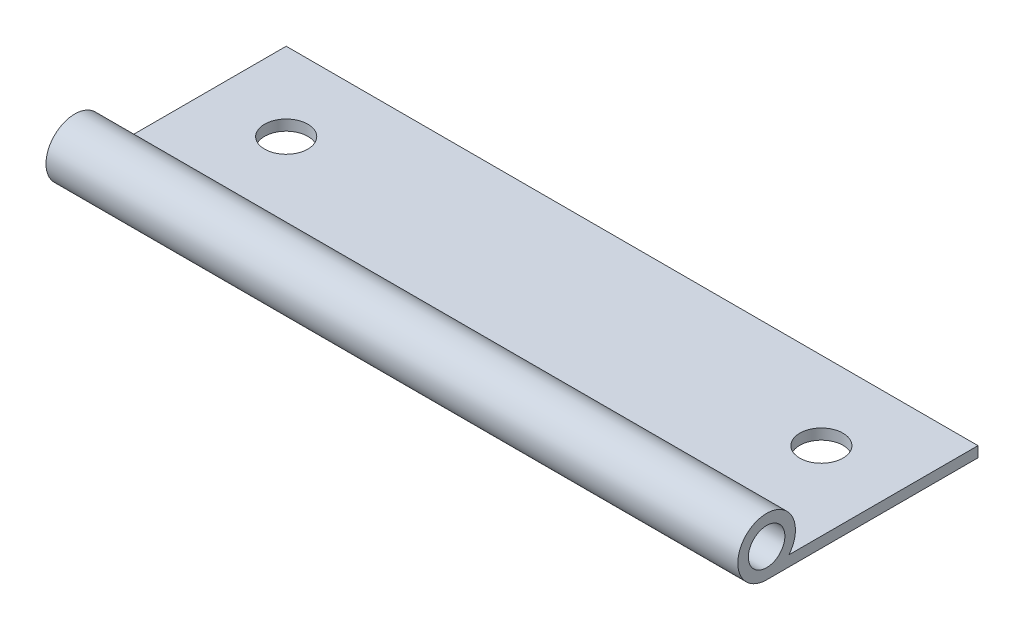
ISO-10303-21;
HEADER;
FILE_DESCRIPTION(('STEP AP214'),'2;1');
FILE_NAME('part.step','',(''),(''),'','','');
FILE_SCHEMA(('AUTOMOTIVE_DESIGN { 1 0 10303 214 1 1 1 1 }'));
ENDSEC;
DATA;
#1=APPLICATION_CONTEXT('core data for automotive mechanical design processes');
#2=APPLICATION_PROTOCOL_DEFINITION('international standard','automotive_design',2000,#1);
#3=PRODUCT_CONTEXT('',#1,'mechanical');
#4=PRODUCT('Part','Part','',(#3));
#5=PRODUCT_RELATED_PRODUCT_CATEGORY('part','',(#4));
#6=PRODUCT_DEFINITION_FORMATION('','',#4);
#7=PRODUCT_DEFINITION_CONTEXT('part definition',#1,'design');
#8=PRODUCT_DEFINITION('design','',#6,#7);
#9=PRODUCT_DEFINITION_SHAPE('','',#8);
#10=(LENGTH_UNIT() NAMED_UNIT(*) SI_UNIT(.MILLI.,.METRE.));
#11=(NAMED_UNIT(*) PLANE_ANGLE_UNIT() SI_UNIT($,.RADIAN.));
#12=(NAMED_UNIT(*) SI_UNIT($,.STERADIAN.) SOLID_ANGLE_UNIT());
#13=UNCERTAINTY_MEASURE_WITH_UNIT(LENGTH_MEASURE(1.E-05),#10,'distance_accuracy_value','');
#14=(GEOMETRIC_REPRESENTATION_CONTEXT(3) GLOBAL_UNCERTAINTY_ASSIGNED_CONTEXT((#13)) GLOBAL_UNIT_ASSIGNED_CONTEXT((#10,
#11,#12)) REPRESENTATION_CONTEXT('',''));
#15=CARTESIAN_POINT('',(0.,0.,0.));
#16=DIRECTION('',(0.,0.,1.));
#17=DIRECTION('',(1.,0.,0.));
#18=AXIS2_PLACEMENT_3D('',#15,#16,#17);
#19=CARTESIAN_POINT('',(72.,1.9,3.));
#20=DIRECTION('',(1.,0.,0.));
#21=DIRECTION('',(0.,0.,-1.));
#22=AXIS2_PLACEMENT_3D('',#19,#20,#21);
#23=PLANE('',#22);
#24=DIRECTION('',(0.,0.,1.));
#25=VECTOR('',#24,1.);
#26=CARTESIAN_POINT('',(72.,0.,0.));
#27=LINE('',#26,#25);
#28=CARTESIAN_POINT('',(72.,0.,-19.));
#29=VERTEX_POINT('',#28);
#30=CARTESIAN_POINT('',(72.,0.,0.678362646751216));
#31=VERTEX_POINT('',#30);
#32=EDGE_CURVE('E50',#29,#31,#27,.T.);
#33=ORIENTED_EDGE('',*,*,#32,.T.);
#34=CARTESIAN_POINT('',(72.,1.9,3.));
#35=DIRECTION('',(1.,0.,0.));
#36=DIRECTION('',(0.,0.,-1.));
#37=AXIS2_PLACEMENT_3D('',#34,#35,#36);
#38=CIRCLE('',#37,3.);
#39=CARTESIAN_POINT('',(72.,-1.1,3.));
#40=VERTEX_POINT('',#39);
#41=EDGE_CURVE('E80',#31,#40,#38,.T.);
#42=ORIENTED_EDGE('',*,*,#41,.T.);
#43=DIRECTION('',(0.,0.,-1.));
#44=VECTOR('',#43,1.);
#45=CARTESIAN_POINT('',(72.,-1.1,0.));
#46=LINE('',#45,#44);
#47=CARTESIAN_POINT('',(72.,-1.1,-19.));
#48=VERTEX_POINT('',#47);
#49=EDGE_CURVE('E84',#40,#48,#46,.T.);
#50=ORIENTED_EDGE('',*,*,#49,.T.);
#51=DIRECTION('',(0.,1.,0.));
#52=VECTOR('',#51,1.);
#53=CARTESIAN_POINT('',(72.,0.,-19.));
#54=LINE('',#53,#52);
#55=EDGE_CURVE('E92',#48,#29,#54,.T.);
#56=ORIENTED_EDGE('',*,*,#55,.T.);
#57=EDGE_LOOP('',(#33,#42,#50,#56));
#58=FACE_BOUND('',#57,.T.);
#59=CARTESIAN_POINT('',(72.,1.9,3.));
#60=DIRECTION('',(1.,0.,0.));
#61=DIRECTION('',(0.,0.,-1.));
#62=AXIS2_PLACEMENT_3D('',#59,#60,#61);
#63=CIRCLE('',#62,1.9);
#64=CARTESIAN_POINT('',(72.,1.9,1.1));
#65=VERTEX_POINT('',#64);
#66=EDGE_CURVE('E99',#65,#65,#63,.T.);
#67=ORIENTED_EDGE('',*,*,#66,.F.);
#68=EDGE_LOOP('',(#67));
#69=FACE_BOUND('',#68,.T.);
#70=ADVANCED_FACE('F33',(#58,#69),#23,.T.);
#71=CARTESIAN_POINT('',(0.,1.9,3.));
#72=DIRECTION('',(1.,0.,0.));
#73=DIRECTION('',(0.,0.,-1.));
#74=AXIS2_PLACEMENT_3D('',#71,#72,#73);
#75=PLANE('',#74);
#76=CARTESIAN_POINT('',(0.,1.9,3.));
#77=DIRECTION('',(1.,0.,0.));
#78=DIRECTION('',(0.,0.,-1.));
#79=AXIS2_PLACEMENT_3D('',#76,#77,#78);
#80=CIRCLE('',#79,3.);
#81=CARTESIAN_POINT('',(0.,0.,0.678362646751216));
#82=VERTEX_POINT('',#81);
#83=CARTESIAN_POINT('',(0.,-1.1,3.));
#84=VERTEX_POINT('',#83);
#85=EDGE_CURVE('E88',#82,#84,#80,.T.);
#86=ORIENTED_EDGE('',*,*,#85,.F.);
#87=DIRECTION('',(0.,0.,1.));
#88=VECTOR('',#87,1.);
#89=CARTESIAN_POINT('',(0.,0.,0.));
#90=LINE('',#89,#88);
#91=CARTESIAN_POINT('',(0.,0.,-19.));
#92=VERTEX_POINT('',#91);
#93=EDGE_CURVE('E102',#92,#82,#90,.T.);
#94=ORIENTED_EDGE('',*,*,#93,.F.);
#95=DIRECTION('',(0.,1.,0.));
#96=VECTOR('',#95,1.);
#97=CARTESIAN_POINT('',(0.,0.,-19.));
#98=LINE('',#97,#96);
#99=CARTESIAN_POINT('',(0.,-1.1,-19.));
#100=VERTEX_POINT('',#99);
#101=EDGE_CURVE('E74',#100,#92,#98,.T.);
#102=ORIENTED_EDGE('',*,*,#101,.F.);
#103=DIRECTION('',(0.,0.,-1.));
#104=VECTOR('',#103,1.);
#105=CARTESIAN_POINT('',(0.,-1.1,-19.));
#106=LINE('',#105,#104);
#107=EDGE_CURVE('E67',#84,#100,#106,.T.);
#108=ORIENTED_EDGE('',*,*,#107,.F.);
#109=EDGE_LOOP('',(#86,#94,#102,#108));
#110=FACE_BOUND('',#109,.T.);
#111=CARTESIAN_POINT('',(0.,1.9,3.));
#112=DIRECTION('',(1.,0.,0.));
#113=DIRECTION('',(0.,0.,-1.));
#114=AXIS2_PLACEMENT_3D('',#111,#112,#113);
#115=CIRCLE('',#114,1.9);
#116=CARTESIAN_POINT('',(0.,1.9,1.1));
#117=VERTEX_POINT('',#116);
#118=EDGE_CURVE('E155',#117,#117,#115,.T.);
#119=ORIENTED_EDGE('',*,*,#118,.T.);
#120=EDGE_LOOP('',(#119));
#121=FACE_BOUND('',#120,.T.);
#122=ADVANCED_FACE('F108',(#110,#121),#75,.F.);
#123=CARTESIAN_POINT('',(72.,1.9,3.));
#124=DIRECTION('',(-1.,0.,0.));
#125=DIRECTION('',(0.,0.,1.));
#126=AXIS2_PLACEMENT_3D('',#123,#124,#125);
#127=CYLINDRICAL_SURFACE('',#126,3.);
#128=ORIENTED_EDGE('',*,*,#85,.T.);
#129=DIRECTION('',(-1.,0.,0.));
#130=VECTOR('',#129,1.);
#131=CARTESIAN_POINT('',(72.,-1.1,3.));
#132=LINE('',#131,#130);
#133=EDGE_CURVE('E42',#40,#84,#132,.T.);
#134=ORIENTED_EDGE('',*,*,#133,.F.);
#135=ORIENTED_EDGE('',*,*,#41,.F.);
#136=DIRECTION('',(-1.,0.,0.));
#137=VECTOR('',#136,1.);
#138=CARTESIAN_POINT('',(72.,0.,0.678362646751216));
#139=LINE('',#138,#137);
#140=EDGE_CURVE('E11',#31,#82,#139,.T.);
#141=ORIENTED_EDGE('',*,*,#140,.T.);
#142=EDGE_LOOP('',(#128,#134,#135,#141));
#143=FACE_BOUND('',#142,.T.);
#144=ADVANCED_FACE('F35',(#143),#127,.T.);
#145=CARTESIAN_POINT('',(72.,-1.1,-19.));
#146=DIRECTION('',(0.,1.,0.));
#147=DIRECTION('',(0.,0.,1.));
#148=AXIS2_PLACEMENT_3D('',#145,#146,#147);
#149=PLANE('',#148);
#150=CARTESIAN_POINT('',(63.85,-1.1,-10.85));
#151=DIRECTION('',(0.,1.,0.));
#152=DIRECTION('',(0.,0.,-1.));
#153=AXIS2_PLACEMENT_3D('',#150,#151,#152);
#154=CIRCLE('',#153,2.25);
#155=CARTESIAN_POINT('',(63.85,-1.1,-13.1));
#156=VERTEX_POINT('',#155);
#157=EDGE_CURVE('E145',#156,#156,#154,.T.);
#158=ORIENTED_EDGE('',*,*,#157,.T.);
#159=EDGE_LOOP('',(#158));
#160=FACE_BOUND('',#159,.T.);
#161=CARTESIAN_POINT('',(8.15,-1.1,-10.85));
#162=DIRECTION('',(0.,1.,0.));
#163=DIRECTION('',(0.,0.,1.));
#164=AXIS2_PLACEMENT_3D('',#161,#162,#163);
#165=CIRCLE('',#164,2.25);
#166=CARTESIAN_POINT('',(8.15,-1.1,-8.6));
#167=VERTEX_POINT('',#166);
#168=EDGE_CURVE('E152',#167,#167,#165,.T.);
#169=ORIENTED_EDGE('',*,*,#168,.T.);
#170=EDGE_LOOP('',(#169));
#171=FACE_BOUND('',#170,.T.);
#172=ORIENTED_EDGE('',*,*,#107,.T.);
#173=DIRECTION('',(-1.,0.,0.));
#174=VECTOR('',#173,1.);
#175=CARTESIAN_POINT('',(72.,-1.1,-19.));
#176=LINE('',#175,#174);
#177=EDGE_CURVE('E89',#48,#100,#176,.T.);
#178=ORIENTED_EDGE('',*,*,#177,.F.);
#179=ORIENTED_EDGE('',*,*,#49,.F.);
#180=ORIENTED_EDGE('',*,*,#133,.T.);
#181=EDGE_LOOP('',(#172,#178,#179,#180));
#182=FACE_BOUND('',#181,.T.);
#183=ADVANCED_FACE('F90',(#160,#171,#182),#149,.F.);
#184=CARTESIAN_POINT('',(72.,0.,-19.));
#185=DIRECTION('',(0.,0.,1.));
#186=DIRECTION('',(1.,0.,0.));
#187=AXIS2_PLACEMENT_3D('',#184,#185,#186);
#188=PLANE('',#187);
#189=ORIENTED_EDGE('',*,*,#101,.T.);
#190=DIRECTION('',(-1.,0.,0.));
#191=VECTOR('',#190,1.);
#192=CARTESIAN_POINT('',(72.,0.,-19.));
#193=LINE('',#192,#191);
#194=EDGE_CURVE('E94',#29,#92,#193,.T.);
#195=ORIENTED_EDGE('',*,*,#194,.F.);
#196=ORIENTED_EDGE('',*,*,#55,.F.);
#197=ORIENTED_EDGE('',*,*,#177,.T.);
#198=EDGE_LOOP('',(#189,#195,#196,#197));
#199=FACE_BOUND('',#198,.T.);
#200=ADVANCED_FACE('F105',(#199),#188,.F.);
#201=CARTESIAN_POINT('',(72.,0.,0.));
#202=DIRECTION('',(0.,-1.,0.));
#203=DIRECTION('',(0.,0.,-1.));
#204=AXIS2_PLACEMENT_3D('',#201,#202,#203);
#205=PLANE('',#204);
#206=CARTESIAN_POINT('',(63.85,0.,-10.85));
#207=DIRECTION('',(0.,1.,0.));
#208=DIRECTION('',(0.,0.,-1.));
#209=AXIS2_PLACEMENT_3D('',#206,#207,#208);
#210=CIRCLE('',#209,2.25);
#211=CARTESIAN_POINT('',(63.85,0.,-13.1));
#212=VERTEX_POINT('',#211);
#213=EDGE_CURVE('E147',#212,#212,#210,.T.);
#214=ORIENTED_EDGE('',*,*,#213,.F.);
#215=EDGE_LOOP('',(#214));
#216=FACE_BOUND('',#215,.T.);
#217=CARTESIAN_POINT('',(8.15,0.,-10.85));
#218=DIRECTION('',(0.,1.,0.));
#219=DIRECTION('',(0.,0.,1.));
#220=AXIS2_PLACEMENT_3D('',#217,#218,#219);
#221=CIRCLE('',#220,2.25);
#222=CARTESIAN_POINT('',(8.15,0.,-8.6));
#223=VERTEX_POINT('',#222);
#224=EDGE_CURVE('E149',#223,#223,#221,.T.);
#225=ORIENTED_EDGE('',*,*,#224,.F.);
#226=EDGE_LOOP('',(#225));
#227=FACE_BOUND('',#226,.T.);
#228=ORIENTED_EDGE('',*,*,#93,.T.);
#229=ORIENTED_EDGE('',*,*,#140,.F.);
#230=ORIENTED_EDGE('',*,*,#32,.F.);
#231=ORIENTED_EDGE('',*,*,#194,.T.);
#232=EDGE_LOOP('',(#228,#229,#230,#231));
#233=FACE_BOUND('',#232,.T.);
#234=ADVANCED_FACE('F110',(#216,#227,#233),#205,.F.);
#235=CARTESIAN_POINT('',(72.,1.9,3.));
#236=DIRECTION('',(-1.,0.,0.));
#237=DIRECTION('',(0.,0.,1.));
#238=AXIS2_PLACEMENT_3D('',#235,#236,#237);
#239=CYLINDRICAL_SURFACE('',#238,1.9);
#240=ORIENTED_EDGE('',*,*,#66,.T.);
#241=EDGE_LOOP('',(#240));
#242=FACE_BOUND('',#241,.T.);
#243=ORIENTED_EDGE('',*,*,#118,.F.);
#244=EDGE_LOOP('',(#243));
#245=FACE_BOUND('',#244,.T.);
#246=ADVANCED_FACE('F112',(#242,#245),#239,.F.);
#247=CARTESIAN_POINT('',(8.15,-1.1,-10.85));
#248=DIRECTION('',(0.,1.,0.));
#249=DIRECTION('',(0.,0.,1.));
#250=AXIS2_PLACEMENT_3D('',#247,#248,#249);
#251=CYLINDRICAL_SURFACE('',#250,2.25);
#252=ORIENTED_EDGE('',*,*,#168,.F.);
#253=EDGE_LOOP('',(#252));
#254=FACE_BOUND('',#253,.T.);
#255=ORIENTED_EDGE('',*,*,#224,.T.);
#256=EDGE_LOOP('',(#255));
#257=FACE_BOUND('',#256,.T.);
#258=ADVANCED_FACE('F120',(#254,#257),#251,.F.);
#259=CARTESIAN_POINT('',(63.85,-1.1,-10.85));
#260=DIRECTION('',(0.,1.,0.));
#261=DIRECTION('',(0.,0.,1.));
#262=AXIS2_PLACEMENT_3D('',#259,#260,#261);
#263=CYLINDRICAL_SURFACE('',#262,2.25);
#264=ORIENTED_EDGE('',*,*,#157,.F.);
#265=EDGE_LOOP('',(#264));
#266=FACE_BOUND('',#265,.T.);
#267=ORIENTED_EDGE('',*,*,#213,.T.);
#268=EDGE_LOOP('',(#267));
#269=FACE_BOUND('',#268,.T.);
#270=ADVANCED_FACE('F136',(#266,#269),#263,.F.);
#271=CLOSED_SHELL('',(#70,#122,#144,#183,#200,#234,#246,#258,#270));
#272=MANIFOLD_SOLID_BREP('B2',#271);
#273=ADVANCED_BREP_SHAPE_REPRESENTATION('',(#18,#272),#14);
#274=SHAPE_DEFINITION_REPRESENTATION(#9,#273);
ENDSEC;
END-ISO-10303-21;
